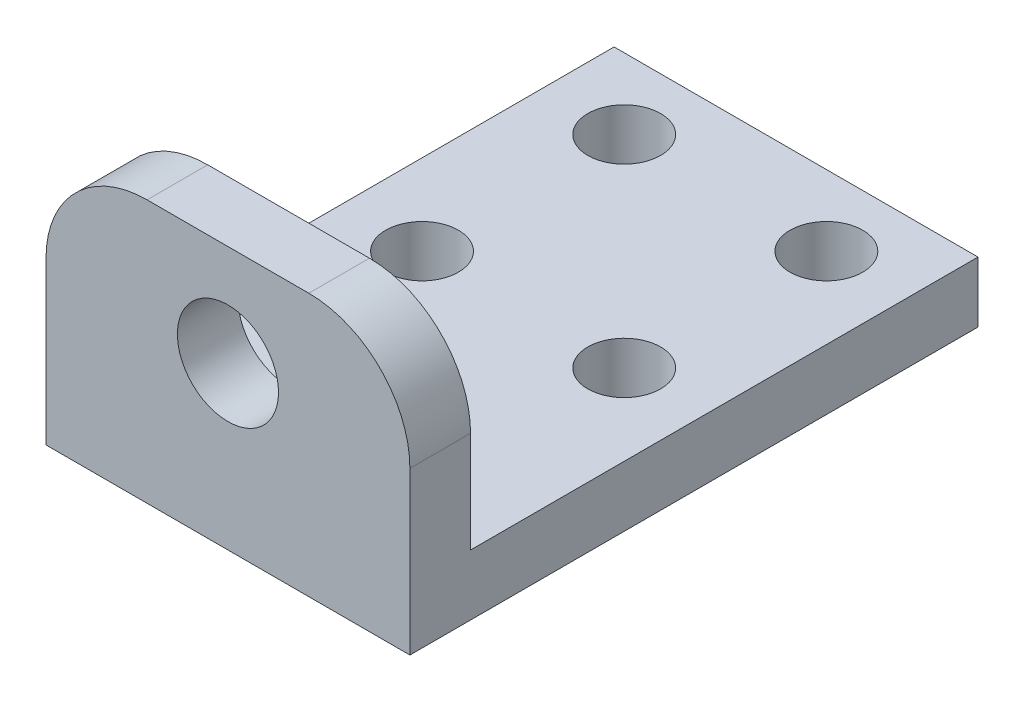
ISO-10303-21;
HEADER;
FILE_DESCRIPTION(('STEP AP214'),'2;1');
FILE_NAME('part.step','',(''),(''),'','','');
FILE_SCHEMA(('AUTOMOTIVE_DESIGN { 1 0 10303 214 1 1 1 1 }'));
ENDSEC;
DATA;
#1=APPLICATION_CONTEXT('core data for automotive mechanical design processes');
#2=APPLICATION_PROTOCOL_DEFINITION('international standard','automotive_design',2000,#1);
#3=PRODUCT_CONTEXT('',#1,'mechanical');
#4=PRODUCT('Part','Part','',(#3));
#5=PRODUCT_RELATED_PRODUCT_CATEGORY('part','',(#4));
#6=PRODUCT_DEFINITION_FORMATION('','',#4);
#7=PRODUCT_DEFINITION_CONTEXT('part definition',#1,'design');
#8=PRODUCT_DEFINITION('design','',#6,#7);
#9=PRODUCT_DEFINITION_SHAPE('','',#8);
#10=(LENGTH_UNIT() NAMED_UNIT(*) SI_UNIT(.MILLI.,.METRE.));
#11=(NAMED_UNIT(*) PLANE_ANGLE_UNIT() SI_UNIT($,.RADIAN.));
#12=(NAMED_UNIT(*) SI_UNIT($,.STERADIAN.) SOLID_ANGLE_UNIT());
#13=UNCERTAINTY_MEASURE_WITH_UNIT(LENGTH_MEASURE(1.E-05),#10,'distance_accuracy_value','');
#14=(GEOMETRIC_REPRESENTATION_CONTEXT(3) GLOBAL_UNCERTAINTY_ASSIGNED_CONTEXT((#13)) GLOBAL_UNIT_ASSIGNED_CONTEXT((#10,
#11,#12)) REPRESENTATION_CONTEXT('',''));
#15=CARTESIAN_POINT('',(0.,0.,0.));
#16=DIRECTION('',(0.,0.,1.));
#17=DIRECTION('',(1.,0.,0.));
#18=AXIS2_PLACEMENT_3D('',#15,#16,#17);
#19=CARTESIAN_POINT('',(18.,13.,0.));
#20=DIRECTION('',(0.,0.,-1.));
#21=DIRECTION('',(0.,1.,0.));
#22=AXIS2_PLACEMENT_3D('',#19,#20,#21);
#23=PLANE('',#22);
#24=CARTESIAN_POINT('',(9.,8.,0.));
#25=DIRECTION('',(0.,0.,1.));
#26=DIRECTION('',(1.,0.,0.));
#27=AXIS2_PLACEMENT_3D('',#24,#25,#26);
#28=CIRCLE('',#27,2.5);
#29=CARTESIAN_POINT('',(11.5,8.,0.));
#30=VERTEX_POINT('',#29);
#31=EDGE_CURVE('E189',#30,#30,#28,.T.);
#32=ORIENTED_EDGE('',*,*,#31,.F.);
#33=EDGE_LOOP('',(#32));
#34=FACE_BOUND('',#33,.T.);
#35=DIRECTION('',(-1.,0.,0.));
#36=VECTOR('',#35,1.);
#37=CARTESIAN_POINT('',(18.,13.,0.));
#38=LINE('',#37,#36);
#39=CARTESIAN_POINT('',(13.,13.,0.));
#40=VERTEX_POINT('',#39);
#41=CARTESIAN_POINT('',(5.,13.,0.));
#42=VERTEX_POINT('',#41);
#43=EDGE_CURVE('E175',#40,#42,#38,.T.);
#44=ORIENTED_EDGE('',*,*,#43,.T.);
#45=CARTESIAN_POINT('',(5.,8.,0.));
#46=DIRECTION('',(0.,0.,-1.));
#47=DIRECTION('',(0.,1.,0.));
#48=AXIS2_PLACEMENT_3D('',#45,#46,#47);
#49=CIRCLE('',#48,5.);
#50=CARTESIAN_POINT('',(0.,8.,0.));
#51=VERTEX_POINT('',#50);
#52=EDGE_CURVE('E155',#42,#51,#49,.F.);
#53=ORIENTED_EDGE('',*,*,#52,.T.);
#54=DIRECTION('',(0.,-1.,0.));
#55=VECTOR('',#54,1.);
#56=CARTESIAN_POINT('',(0.,13.,0.));
#57=LINE('',#56,#55);
#58=CARTESIAN_POINT('',(0.,0.,0.));
#59=VERTEX_POINT('',#58);
#60=EDGE_CURVE('E136',#51,#59,#57,.T.);
#61=ORIENTED_EDGE('',*,*,#60,.T.);
#62=DIRECTION('',(-1.,0.,0.));
#63=VECTOR('',#62,1.);
#64=CARTESIAN_POINT('',(18.,0.,0.));
#65=LINE('',#64,#63);
#66=CARTESIAN_POINT('',(18.,0.,0.));
#67=VERTEX_POINT('',#66);
#68=EDGE_CURVE('E128',#67,#59,#65,.T.);
#69=ORIENTED_EDGE('',*,*,#68,.F.);
#70=DIRECTION('',(0.,-1.,0.));
#71=VECTOR('',#70,1.);
#72=CARTESIAN_POINT('',(18.,13.,0.));
#73=LINE('',#72,#71);
#74=CARTESIAN_POINT('',(18.,8.,0.));
#75=VERTEX_POINT('',#74);
#76=EDGE_CURVE('E114',#75,#67,#73,.T.);
#77=ORIENTED_EDGE('',*,*,#76,.F.);
#78=CARTESIAN_POINT('',(13.,8.,0.));
#79=DIRECTION('',(0.,0.,-1.));
#80=DIRECTION('',(0.,1.,0.));
#81=AXIS2_PLACEMENT_3D('',#78,#79,#80);
#82=CIRCLE('',#81,5.);
#83=EDGE_CURVE('E152',#75,#40,#82,.F.);
#84=ORIENTED_EDGE('',*,*,#83,.T.);
#85=EDGE_LOOP('',(#44,#53,#61,#69,#77,#84));
#86=FACE_BOUND('',#85,.T.);
#87=ADVANCED_FACE('F45',(#34,#86),#23,.F.);
#88=CARTESIAN_POINT('',(18.,0.,0.));
#89=DIRECTION('',(0.,1.,0.));
#90=DIRECTION('',(0.,0.,1.));
#91=AXIS2_PLACEMENT_3D('',#88,#89,#90);
#92=PLANE('',#91);
#93=CARTESIAN_POINT('',(4.,0.,-24.6));
#94=DIRECTION('',(0.,1.,0.));
#95=DIRECTION('',(0.,0.,1.));
#96=AXIS2_PLACEMENT_3D('',#93,#94,#95);
#97=CIRCLE('',#96,1.79999999999998);
#98=CARTESIAN_POINT('',(4.,0.,-22.8));
#99=VERTEX_POINT('',#98);
#100=EDGE_CURVE('E247',#99,#99,#97,.T.);
#101=ORIENTED_EDGE('',*,*,#100,.T.);
#102=EDGE_LOOP('',(#101));
#103=FACE_BOUND('',#102,.T.);
#104=CARTESIAN_POINT('',(4.,0.,-14.6));
#105=DIRECTION('',(0.,1.,0.));
#106=DIRECTION('',(0.,0.,1.));
#107=AXIS2_PLACEMENT_3D('',#104,#105,#106);
#108=CIRCLE('',#107,1.79999999999998);
#109=CARTESIAN_POINT('',(4.,0.,-12.8));
#110=VERTEX_POINT('',#109);
#111=EDGE_CURVE('E239',#110,#110,#108,.T.);
#112=ORIENTED_EDGE('',*,*,#111,.T.);
#113=EDGE_LOOP('',(#112));
#114=FACE_BOUND('',#113,.T.);
#115=CARTESIAN_POINT('',(14.,0.,-14.6));
#116=DIRECTION('',(0.,1.,0.));
#117=DIRECTION('',(0.,0.,1.));
#118=AXIS2_PLACEMENT_3D('',#115,#116,#117);
#119=CIRCLE('',#118,1.79999999999998);
#120=CARTESIAN_POINT('',(14.,0.,-12.8));
#121=VERTEX_POINT('',#120);
#122=EDGE_CURVE('E231',#121,#121,#119,.T.);
#123=ORIENTED_EDGE('',*,*,#122,.T.);
#124=EDGE_LOOP('',(#123));
#125=FACE_BOUND('',#124,.T.);
#126=CARTESIAN_POINT('',(14.,0.,-24.6));
#127=DIRECTION('',(0.,1.,0.));
#128=DIRECTION('',(0.,0.,1.));
#129=AXIS2_PLACEMENT_3D('',#126,#127,#128);
#130=CIRCLE('',#129,1.79999999999998);
#131=CARTESIAN_POINT('',(14.,0.,-22.8));
#132=VERTEX_POINT('',#131);
#133=EDGE_CURVE('E222',#132,#132,#130,.T.);
#134=ORIENTED_EDGE('',*,*,#133,.T.);
#135=EDGE_LOOP('',(#134));
#136=FACE_BOUND('',#135,.T.);
#137=DIRECTION('',(0.,0.,-1.));
#138=VECTOR('',#137,1.);
#139=CARTESIAN_POINT('',(0.,0.,0.));
#140=LINE('',#139,#138);
#141=CARTESIAN_POINT('',(0.,0.,-28.1));
#142=VERTEX_POINT('',#141);
#143=EDGE_CURVE('E180',#59,#142,#140,.T.);
#144=ORIENTED_EDGE('',*,*,#143,.T.);
#145=DIRECTION('',(-1.,0.,0.));
#146=VECTOR('',#145,1.);
#147=CARTESIAN_POINT('',(18.,0.,-28.1));
#148=LINE('',#147,#146);
#149=CARTESIAN_POINT('',(18.,0.,-28.1));
#150=VERTEX_POINT('',#149);
#151=EDGE_CURVE('E130',#150,#142,#148,.T.);
#152=ORIENTED_EDGE('',*,*,#151,.F.);
#153=DIRECTION('',(0.,0.,-1.));
#154=VECTOR('',#153,1.);
#155=CARTESIAN_POINT('',(18.,0.,0.));
#156=LINE('',#155,#154);
#157=EDGE_CURVE('E117',#67,#150,#156,.T.);
#158=ORIENTED_EDGE('',*,*,#157,.F.);
#159=ORIENTED_EDGE('',*,*,#68,.T.);
#160=EDGE_LOOP('',(#144,#152,#158,#159));
#161=FACE_BOUND('',#160,.T.);
#162=ADVANCED_FACE('F127',(#103,#114,#125,#136,#161),#92,.F.);
#163=CARTESIAN_POINT('',(18.,0.,-28.1));
#164=DIRECTION('',(0.,0.,1.));
#165=DIRECTION('',(1.,0.,0.));
#166=AXIS2_PLACEMENT_3D('',#163,#164,#165);
#167=PLANE('',#166);
#168=DIRECTION('',(0.,1.,0.));
#169=VECTOR('',#168,1.);
#170=CARTESIAN_POINT('',(0.,0.,-28.1));
#171=LINE('',#170,#169);
#172=CARTESIAN_POINT('',(0.,3.,-28.1));
#173=VERTEX_POINT('',#172);
#174=EDGE_CURVE('E186',#142,#173,#171,.T.);
#175=ORIENTED_EDGE('',*,*,#174,.T.);
#176=DIRECTION('',(-1.,0.,0.));
#177=VECTOR('',#176,1.);
#178=CARTESIAN_POINT('',(18.,3.,-28.1));
#179=LINE('',#178,#177);
#180=CARTESIAN_POINT('',(18.,3.,-28.1));
#181=VERTEX_POINT('',#180);
#182=EDGE_CURVE('E145',#181,#173,#179,.T.);
#183=ORIENTED_EDGE('',*,*,#182,.F.);
#184=DIRECTION('',(0.,1.,0.));
#185=VECTOR('',#184,1.);
#186=CARTESIAN_POINT('',(18.,0.,-28.1));
#187=LINE('',#186,#185);
#188=EDGE_CURVE('E133',#150,#181,#187,.T.);
#189=ORIENTED_EDGE('',*,*,#188,.F.);
#190=ORIENTED_EDGE('',*,*,#151,.T.);
#191=EDGE_LOOP('',(#175,#183,#189,#190));
#192=FACE_BOUND('',#191,.T.);
#193=ADVANCED_FACE('F215',(#192),#167,.F.);
#194=CARTESIAN_POINT('',(18.,3.,-28.1));
#195=DIRECTION('',(0.,-1.,0.));
#196=DIRECTION('',(0.,0.,-1.));
#197=AXIS2_PLACEMENT_3D('',#194,#195,#196);
#198=PLANE('',#197);
#199=CARTESIAN_POINT('',(4.,3.,-24.6));
#200=DIRECTION('',(0.,1.,0.));
#201=DIRECTION('',(0.,0.,1.));
#202=AXIS2_PLACEMENT_3D('',#199,#200,#201);
#203=CIRCLE('',#202,1.79999999999999);
#204=CARTESIAN_POINT('',(4.,3.,-22.8));
#205=VERTEX_POINT('',#204);
#206=EDGE_CURVE('E251',#205,#205,#203,.T.);
#207=ORIENTED_EDGE('',*,*,#206,.F.);
#208=EDGE_LOOP('',(#207));
#209=FACE_BOUND('',#208,.T.);
#210=CARTESIAN_POINT('',(4.,3.,-14.6));
#211=DIRECTION('',(0.,1.,0.));
#212=DIRECTION('',(0.,0.,1.));
#213=AXIS2_PLACEMENT_3D('',#210,#211,#212);
#214=CIRCLE('',#213,1.79999999999999);
#215=CARTESIAN_POINT('',(4.,3.,-12.8));
#216=VERTEX_POINT('',#215);
#217=EDGE_CURVE('E243',#216,#216,#214,.T.);
#218=ORIENTED_EDGE('',*,*,#217,.F.);
#219=EDGE_LOOP('',(#218));
#220=FACE_BOUND('',#219,.T.);
#221=CARTESIAN_POINT('',(14.,3.,-14.6));
#222=DIRECTION('',(0.,1.,0.));
#223=DIRECTION('',(0.,0.,1.));
#224=AXIS2_PLACEMENT_3D('',#221,#222,#223);
#225=CIRCLE('',#224,1.79999999999999);
#226=CARTESIAN_POINT('',(14.,3.,-12.8));
#227=VERTEX_POINT('',#226);
#228=EDGE_CURVE('E235',#227,#227,#225,.T.);
#229=ORIENTED_EDGE('',*,*,#228,.F.);
#230=EDGE_LOOP('',(#229));
#231=FACE_BOUND('',#230,.T.);
#232=CARTESIAN_POINT('',(14.,3.,-24.6));
#233=DIRECTION('',(0.,1.,0.));
#234=DIRECTION('',(0.,0.,1.));
#235=AXIS2_PLACEMENT_3D('',#232,#233,#234);
#236=CIRCLE('',#235,1.79999999999999);
#237=CARTESIAN_POINT('',(14.,3.,-22.8));
#238=VERTEX_POINT('',#237);
#239=EDGE_CURVE('E227',#238,#238,#236,.T.);
#240=ORIENTED_EDGE('',*,*,#239,.F.);
#241=EDGE_LOOP('',(#240));
#242=FACE_BOUND('',#241,.T.);
#243=DIRECTION('',(0.,0.,1.));
#244=VECTOR('',#243,1.);
#245=CARTESIAN_POINT('',(0.,3.,-28.1));
#246=LINE('',#245,#244);
#247=CARTESIAN_POINT('',(0.,3.,-3.));
#248=VERTEX_POINT('',#247);
#249=EDGE_CURVE('E197',#173,#248,#246,.T.);
#250=ORIENTED_EDGE('',*,*,#249,.T.);
#251=DIRECTION('',(-1.,0.,0.));
#252=VECTOR('',#251,1.);
#253=CARTESIAN_POINT('',(18.,3.,-3.));
#254=LINE('',#253,#252);
#255=CARTESIAN_POINT('',(18.,3.,-3.));
#256=VERTEX_POINT('',#255);
#257=EDGE_CURVE('E174',#256,#248,#254,.T.);
#258=ORIENTED_EDGE('',*,*,#257,.F.);
#259=DIRECTION('',(0.,0.,1.));
#260=VECTOR('',#259,1.);
#261=CARTESIAN_POINT('',(18.,3.,-28.1));
#262=LINE('',#261,#260);
#263=EDGE_CURVE('E213',#181,#256,#262,.T.);
#264=ORIENTED_EDGE('',*,*,#263,.F.);
#265=ORIENTED_EDGE('',*,*,#182,.T.);
#266=EDGE_LOOP('',(#250,#258,#264,#265));
#267=FACE_BOUND('',#266,.T.);
#268=ADVANCED_FACE('F211',(#209,#220,#231,#242,#267),#198,.F.);
#269=CARTESIAN_POINT('',(18.,3.,-3.));
#270=DIRECTION('',(0.,0.,1.));
#271=DIRECTION('',(0.,-1.,0.));
#272=AXIS2_PLACEMENT_3D('',#269,#270,#271);
#273=PLANE('',#272);
#274=CARTESIAN_POINT('',(9.,8.,-3.));
#275=DIRECTION('',(0.,0.,1.));
#276=DIRECTION('',(0.,-1.,0.));
#277=AXIS2_PLACEMENT_3D('',#274,#275,#276);
#278=CIRCLE('',#277,2.5);
#279=CARTESIAN_POINT('',(9.,5.5,-3.));
#280=VERTEX_POINT('',#279);
#281=EDGE_CURVE('E182',#280,#280,#278,.F.);
#282=ORIENTED_EDGE('',*,*,#281,.F.);
#283=EDGE_LOOP('',(#282));
#284=FACE_BOUND('',#283,.T.);
#285=DIRECTION('',(0.,1.,0.));
#286=VECTOR('',#285,1.);
#287=CARTESIAN_POINT('',(0.,3.,-3.));
#288=LINE('',#287,#286);
#289=CARTESIAN_POINT('',(0.,8.,-3.));
#290=VERTEX_POINT('',#289);
#291=EDGE_CURVE('E123',#248,#290,#288,.T.);
#292=ORIENTED_EDGE('',*,*,#291,.T.);
#293=CARTESIAN_POINT('',(5.,8.,-3.));
#294=DIRECTION('',(0.,0.,1.));
#295=DIRECTION('',(0.,-1.,0.));
#296=AXIS2_PLACEMENT_3D('',#293,#294,#295);
#297=CIRCLE('',#296,5.);
#298=CARTESIAN_POINT('',(5.,13.,-3.));
#299=VERTEX_POINT('',#298);
#300=EDGE_CURVE('E54',#290,#299,#297,.F.);
#301=ORIENTED_EDGE('',*,*,#300,.T.);
#302=DIRECTION('',(-1.,0.,0.));
#303=VECTOR('',#302,1.);
#304=CARTESIAN_POINT('',(18.,13.,-3.));
#305=LINE('',#304,#303);
#306=CARTESIAN_POINT('',(13.,13.,-3.));
#307=VERTEX_POINT('',#306);
#308=EDGE_CURVE('E165',#307,#299,#305,.T.);
#309=ORIENTED_EDGE('',*,*,#308,.F.);
#310=CARTESIAN_POINT('',(13.,8.,-3.));
#311=DIRECTION('',(0.,0.,1.));
#312=DIRECTION('',(0.,-1.,0.));
#313=AXIS2_PLACEMENT_3D('',#310,#311,#312);
#314=CIRCLE('',#313,5.);
#315=CARTESIAN_POINT('',(18.,8.,-3.));
#316=VERTEX_POINT('',#315);
#317=EDGE_CURVE('E61',#307,#316,#314,.F.);
#318=ORIENTED_EDGE('',*,*,#317,.T.);
#319=DIRECTION('',(0.,1.,0.));
#320=VECTOR('',#319,1.);
#321=CARTESIAN_POINT('',(18.,3.,-3.));
#322=LINE('',#321,#320);
#323=EDGE_CURVE('E192',#256,#316,#322,.T.);
#324=ORIENTED_EDGE('',*,*,#323,.F.);
#325=ORIENTED_EDGE('',*,*,#257,.T.);
#326=EDGE_LOOP('',(#292,#301,#309,#318,#324,#325));
#327=FACE_BOUND('',#326,.T.);
#328=ADVANCED_FACE('F164',(#284,#327),#273,.F.);
#329=CARTESIAN_POINT('',(18.,13.,-3.));
#330=DIRECTION('',(0.,-1.,0.));
#331=DIRECTION('',(0.,0.,-1.));
#332=AXIS2_PLACEMENT_3D('',#329,#330,#331);
#333=PLANE('',#332);
#334=ORIENTED_EDGE('',*,*,#308,.T.);
#335=DIRECTION('',(0.,0.,1.));
#336=VECTOR('',#335,1.);
#337=CARTESIAN_POINT('',(5.,13.,-3.));
#338=LINE('',#337,#336);
#339=EDGE_CURVE('E143',#299,#42,#338,.T.);
#340=ORIENTED_EDGE('',*,*,#339,.T.);
#341=ORIENTED_EDGE('',*,*,#43,.F.);
#342=DIRECTION('',(0.,0.,1.));
#343=VECTOR('',#342,1.);
#344=CARTESIAN_POINT('',(13.,13.,-3.));
#345=LINE('',#344,#343);
#346=EDGE_CURVE('E139',#40,#307,#345,.F.);
#347=ORIENTED_EDGE('',*,*,#346,.T.);
#348=EDGE_LOOP('',(#334,#340,#341,#347));
#349=FACE_BOUND('',#348,.T.);
#350=ADVANCED_FACE('F170',(#349),#333,.F.);
#351=CARTESIAN_POINT('',(18.,0.,0.));
#352=DIRECTION('',(1.,0.,0.));
#353=DIRECTION('',(0.,0.,-1.));
#354=AXIS2_PLACEMENT_3D('',#351,#352,#353);
#355=PLANE('',#354);
#356=ORIENTED_EDGE('',*,*,#323,.T.);
#357=DIRECTION('',(0.,0.,1.));
#358=VECTOR('',#357,1.);
#359=CARTESIAN_POINT('',(18.,8.,0.));
#360=LINE('',#359,#358);
#361=EDGE_CURVE('E11',#316,#75,#360,.T.);
#362=ORIENTED_EDGE('',*,*,#361,.T.);
#363=ORIENTED_EDGE('',*,*,#76,.T.);
#364=ORIENTED_EDGE('',*,*,#157,.T.);
#365=ORIENTED_EDGE('',*,*,#188,.T.);
#366=ORIENTED_EDGE('',*,*,#263,.T.);
#367=EDGE_LOOP('',(#356,#362,#363,#364,#365,#366));
#368=FACE_BOUND('',#367,.T.);
#369=ADVANCED_FACE('F116',(#368),#355,.T.);
#370=CARTESIAN_POINT('',(0.,0.,0.));
#371=DIRECTION('',(1.,0.,0.));
#372=DIRECTION('',(0.,0.,-1.));
#373=AXIS2_PLACEMENT_3D('',#370,#371,#372);
#374=PLANE('',#373);
#375=ORIENTED_EDGE('',*,*,#60,.F.);
#376=DIRECTION('',(0.,0.,1.));
#377=VECTOR('',#376,1.);
#378=CARTESIAN_POINT('',(0.,8.,0.));
#379=LINE('',#378,#377);
#380=EDGE_CURVE('E69',#51,#290,#379,.F.);
#381=ORIENTED_EDGE('',*,*,#380,.T.);
#382=ORIENTED_EDGE('',*,*,#291,.F.);
#383=ORIENTED_EDGE('',*,*,#249,.F.);
#384=ORIENTED_EDGE('',*,*,#174,.F.);
#385=ORIENTED_EDGE('',*,*,#143,.F.);
#386=EDGE_LOOP('',(#375,#381,#382,#383,#384,#385));
#387=FACE_BOUND('',#386,.T.);
#388=ADVANCED_FACE('F178',(#387),#374,.F.);
#389=CARTESIAN_POINT('',(9.,8.,0.));
#390=DIRECTION('',(0.,0.,1.));
#391=DIRECTION('',(1.,0.,0.));
#392=AXIS2_PLACEMENT_3D('',#389,#390,#391);
#393=CYLINDRICAL_SURFACE('',#392,2.5);
#394=ORIENTED_EDGE('',*,*,#281,.T.);
#395=EDGE_LOOP('',(#394));
#396=FACE_BOUND('',#395,.T.);
#397=ORIENTED_EDGE('',*,*,#31,.T.);
#398=EDGE_LOOP('',(#397));
#399=FACE_BOUND('',#398,.T.);
#400=ADVANCED_FACE('F295',(#396,#399),#393,.F.);
#401=CARTESIAN_POINT('',(5.,8.,-3.));
#402=DIRECTION('',(0.,0.,1.));
#403=DIRECTION('',(1.,0.,0.));
#404=AXIS2_PLACEMENT_3D('',#401,#402,#403);
#405=CYLINDRICAL_SURFACE('',#404,5.);
#406=ORIENTED_EDGE('',*,*,#300,.F.);
#407=ORIENTED_EDGE('',*,*,#380,.F.);
#408=ORIENTED_EDGE('',*,*,#52,.F.);
#409=ORIENTED_EDGE('',*,*,#339,.F.);
#410=EDGE_LOOP('',(#406,#407,#408,#409));
#411=FACE_BOUND('',#410,.T.);
#412=ADVANCED_FACE('F177',(#411),#405,.T.);
#413=CARTESIAN_POINT('',(13.,8.,0.));
#414=DIRECTION('',(0.,0.,-1.));
#415=DIRECTION('',(-1.,0.,0.));
#416=AXIS2_PLACEMENT_3D('',#413,#414,#415);
#417=CYLINDRICAL_SURFACE('',#416,5.);
#418=ORIENTED_EDGE('',*,*,#317,.F.);
#419=ORIENTED_EDGE('',*,*,#346,.F.);
#420=ORIENTED_EDGE('',*,*,#83,.F.);
#421=ORIENTED_EDGE('',*,*,#361,.F.);
#422=EDGE_LOOP('',(#418,#419,#420,#421));
#423=FACE_BOUND('',#422,.T.);
#424=ADVANCED_FACE('F47',(#423),#417,.T.);
#425=CARTESIAN_POINT('',(14.,3.,-24.6));
#426=DIRECTION('',(0.,1.,0.));
#427=DIRECTION('',(0.,0.,1.));
#428=AXIS2_PLACEMENT_3D('',#425,#426,#427);
#429=CYLINDRICAL_SURFACE('',#428,1.79999999999998);
#430=ORIENTED_EDGE('',*,*,#133,.F.);
#431=EDGE_LOOP('',(#430));
#432=FACE_BOUND('',#431,.T.);
#433=ORIENTED_EDGE('',*,*,#239,.T.);
#434=EDGE_LOOP('',(#433));
#435=FACE_BOUND('',#434,.T.);
#436=ADVANCED_FACE('F267',(#432,#435),#429,.F.);
#437=CARTESIAN_POINT('',(14.,3.,-14.6));
#438=DIRECTION('',(0.,1.,0.));
#439=DIRECTION('',(0.,0.,1.));
#440=AXIS2_PLACEMENT_3D('',#437,#438,#439);
#441=CYLINDRICAL_SURFACE('',#440,1.79999999999998);
#442=ORIENTED_EDGE('',*,*,#122,.F.);
#443=EDGE_LOOP('',(#442));
#444=FACE_BOUND('',#443,.T.);
#445=ORIENTED_EDGE('',*,*,#228,.T.);
#446=EDGE_LOOP('',(#445));
#447=FACE_BOUND('',#446,.T.);
#448=ADVANCED_FACE('F269',(#444,#447),#441,.F.);
#449=CARTESIAN_POINT('',(4.,3.,-14.6));
#450=DIRECTION('',(0.,1.,0.));
#451=DIRECTION('',(0.,0.,1.));
#452=AXIS2_PLACEMENT_3D('',#449,#450,#451);
#453=CYLINDRICAL_SURFACE('',#452,1.79999999999998);
#454=ORIENTED_EDGE('',*,*,#111,.F.);
#455=EDGE_LOOP('',(#454));
#456=FACE_BOUND('',#455,.T.);
#457=ORIENTED_EDGE('',*,*,#217,.T.);
#458=EDGE_LOOP('',(#457));
#459=FACE_BOUND('',#458,.T.);
#460=ADVANCED_FACE('F275',(#456,#459),#453,.F.);
#461=CARTESIAN_POINT('',(4.,3.,-24.6));
#462=DIRECTION('',(0.,1.,0.));
#463=DIRECTION('',(0.,0.,1.));
#464=AXIS2_PLACEMENT_3D('',#461,#462,#463);
#465=CYLINDRICAL_SURFACE('',#464,1.79999999999998);
#466=ORIENTED_EDGE('',*,*,#100,.F.);
#467=EDGE_LOOP('',(#466));
#468=FACE_BOUND('',#467,.T.);
#469=ORIENTED_EDGE('',*,*,#206,.T.);
#470=EDGE_LOOP('',(#469));
#471=FACE_BOUND('',#470,.T.);
#472=ADVANCED_FACE('F256',(#468,#471),#465,.F.);
#473=CLOSED_SHELL('',(#87,#162,#193,#268,#328,#350,#369,#388,#400,#412,#424,#436,#448,#460,#472));
#474=MANIFOLD_SOLID_BREP('B2',#473);
#475=ADVANCED_BREP_SHAPE_REPRESENTATION('',(#18,#474),#14);
#476=SHAPE_DEFINITION_REPRESENTATION(#9,#475);
ENDSEC;
END-ISO-10303-21;
